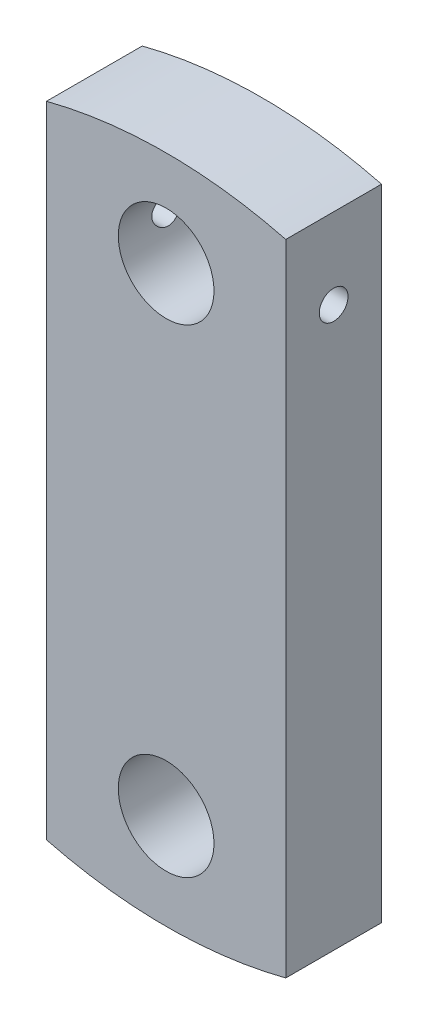
ISO-10303-21;
HEADER;
FILE_DESCRIPTION(('STEP AP214'),'2;1');
FILE_NAME('part.step','',(''),(''),'','','');
FILE_SCHEMA(('AUTOMOTIVE_DESIGN { 1 0 10303 214 1 1 1 1 }'));
ENDSEC;
DATA;
#1=APPLICATION_CONTEXT('core data for automotive mechanical design processes');
#2=APPLICATION_PROTOCOL_DEFINITION('international standard','automotive_design',2000,#1);
#3=PRODUCT_CONTEXT('',#1,'mechanical');
#4=PRODUCT('Part','Part','',(#3));
#5=PRODUCT_RELATED_PRODUCT_CATEGORY('part','',(#4));
#6=PRODUCT_DEFINITION_FORMATION('','',#4);
#7=PRODUCT_DEFINITION_CONTEXT('part definition',#1,'design');
#8=PRODUCT_DEFINITION('design','',#6,#7);
#9=PRODUCT_DEFINITION_SHAPE('','',#8);
#10=(LENGTH_UNIT() NAMED_UNIT(*) SI_UNIT(.MILLI.,.METRE.));
#11=(NAMED_UNIT(*) PLANE_ANGLE_UNIT() SI_UNIT($,.RADIAN.));
#12=(NAMED_UNIT(*) SI_UNIT($,.STERADIAN.) SOLID_ANGLE_UNIT());
#13=UNCERTAINTY_MEASURE_WITH_UNIT(LENGTH_MEASURE(1.E-05),#10,'distance_accuracy_value','');
#14=(GEOMETRIC_REPRESENTATION_CONTEXT(3) GLOBAL_UNCERTAINTY_ASSIGNED_CONTEXT((#13)) GLOBAL_UNIT_ASSIGNED_CONTEXT((#10,
#11,#12)) REPRESENTATION_CONTEXT('',''));
#15=CARTESIAN_POINT('',(0.,0.,0.));
#16=DIRECTION('',(0.,0.,1.));
#17=DIRECTION('',(1.,0.,0.));
#18=AXIS2_PLACEMENT_3D('',#15,#16,#17);
#19=CARTESIAN_POINT('',(0.,15.,10.));
#20=DIRECTION('',(0.,0.,-1.));
#21=DIRECTION('',(-1.,0.,0.));
#22=AXIS2_PLACEMENT_3D('',#19,#20,#21);
#23=PLANE('',#22);
#24=CARTESIAN_POINT('',(0.,15.,10.));
#25=DIRECTION('',(0.,0.,1.));
#26=DIRECTION('',(-1.,0.,0.));
#27=AXIS2_PLACEMENT_3D('',#24,#25,#26);
#28=CIRCLE('',#27,50.);
#29=CARTESIAN_POINT('',(-12.5,-33.4122918275927,10.));
#30=VERTEX_POINT('',#29);
#31=CARTESIAN_POINT('',(12.5,-33.4122918275927,10.));
#32=VERTEX_POINT('',#31);
#33=EDGE_CURVE('E99',#30,#32,#28,.T.);
#34=ORIENTED_EDGE('',*,*,#33,.T.);
#35=DIRECTION('',(0.,1.,0.));
#36=VECTOR('',#35,1.);
#37=CARTESIAN_POINT('',(12.5,-33.4122918275927,10.));
#38=LINE('',#37,#36);
#39=CARTESIAN_POINT('',(12.5,33.4122918275927,10.));
#40=VERTEX_POINT('',#39);
#41=EDGE_CURVE('E94',#32,#40,#38,.T.);
#42=ORIENTED_EDGE('',*,*,#41,.T.);
#43=CARTESIAN_POINT('',(0.,-15.,10.));
#44=DIRECTION('',(0.,0.,1.));
#45=DIRECTION('',(1.,0.,0.));
#46=AXIS2_PLACEMENT_3D('',#43,#44,#45);
#47=CIRCLE('',#46,50.);
#48=CARTESIAN_POINT('',(-12.5,33.4122918275927,10.));
#49=VERTEX_POINT('',#48);
#50=EDGE_CURVE('E97',#40,#49,#47,.T.);
#51=ORIENTED_EDGE('',*,*,#50,.T.);
#52=DIRECTION('',(0.,-1.,0.));
#53=VECTOR('',#52,1.);
#54=CARTESIAN_POINT('',(-12.5,-33.4122918275927,10.));
#55=LINE('',#54,#53);
#56=EDGE_CURVE('E64',#49,#30,#55,.T.);
#57=ORIENTED_EDGE('',*,*,#56,.T.);
#58=EDGE_LOOP('',(#34,#42,#51,#57));
#59=FACE_BOUND('',#58,.T.);
#60=CARTESIAN_POINT('',(0.,-25.,10.));
#61=DIRECTION('',(0.,0.,1.));
#62=DIRECTION('',(1.,0.,0.));
#63=AXIS2_PLACEMENT_3D('',#60,#61,#62);
#64=CIRCLE('',#63,5.);
#65=CARTESIAN_POINT('',(5.00000000000001,-25.,10.));
#66=VERTEX_POINT('',#65);
#67=EDGE_CURVE('E120',#66,#66,#64,.T.);
#68=ORIENTED_EDGE('',*,*,#67,.F.);
#69=EDGE_LOOP('',(#68));
#70=FACE_BOUND('',#69,.T.);
#71=CARTESIAN_POINT('',(0.,25.,10.));
#72=DIRECTION('',(0.,0.,1.));
#73=DIRECTION('',(1.,0.,0.));
#74=AXIS2_PLACEMENT_3D('',#71,#72,#73);
#75=CIRCLE('',#74,5.);
#76=CARTESIAN_POINT('',(5.,25.,10.));
#77=VERTEX_POINT('',#76);
#78=EDGE_CURVE('E183',#77,#77,#75,.T.);
#79=ORIENTED_EDGE('',*,*,#78,.F.);
#80=EDGE_LOOP('',(#79));
#81=FACE_BOUND('',#80,.T.);
#82=ADVANCED_FACE('F39',(#59,#70,#81),#23,.F.);
#83=CARTESIAN_POINT('',(0.,15.,0.));
#84=DIRECTION('',(0.,0.,-1.));
#85=DIRECTION('',(-1.,0.,0.));
#86=AXIS2_PLACEMENT_3D('',#83,#84,#85);
#87=PLANE('',#86);
#88=CARTESIAN_POINT('',(0.,-25.,0.));
#89=DIRECTION('',(0.,0.,1.));
#90=DIRECTION('',(1.,0.,0.));
#91=AXIS2_PLACEMENT_3D('',#88,#89,#90);
#92=CIRCLE('',#91,5.);
#93=CARTESIAN_POINT('',(5.00000000000001,-25.,0.));
#94=VERTEX_POINT('',#93);
#95=EDGE_CURVE('E187',#94,#94,#92,.T.);
#96=ORIENTED_EDGE('',*,*,#95,.T.);
#97=EDGE_LOOP('',(#96));
#98=FACE_BOUND('',#97,.T.);
#99=CARTESIAN_POINT('',(0.,15.,0.));
#100=DIRECTION('',(0.,0.,1.));
#101=DIRECTION('',(-1.,0.,0.));
#102=AXIS2_PLACEMENT_3D('',#99,#100,#101);
#103=CIRCLE('',#102,50.);
#104=CARTESIAN_POINT('',(-12.5,-33.4122918275927,0.));
#105=VERTEX_POINT('',#104);
#106=CARTESIAN_POINT('',(12.5,-33.4122918275927,0.));
#107=VERTEX_POINT('',#106);
#108=EDGE_CURVE('E116',#105,#107,#103,.T.);
#109=ORIENTED_EDGE('',*,*,#108,.F.);
#110=DIRECTION('',(0.,-1.,0.));
#111=VECTOR('',#110,1.);
#112=CARTESIAN_POINT('',(-12.5,-33.4122918275927,0.));
#113=LINE('',#112,#111);
#114=CARTESIAN_POINT('',(-12.5,33.4122918275927,0.));
#115=VERTEX_POINT('',#114);
#116=EDGE_CURVE('E87',#115,#105,#113,.T.);
#117=ORIENTED_EDGE('',*,*,#116,.F.);
#118=CARTESIAN_POINT('',(0.,-15.,0.));
#119=DIRECTION('',(0.,0.,1.));
#120=DIRECTION('',(1.,0.,0.));
#121=AXIS2_PLACEMENT_3D('',#118,#119,#120);
#122=CIRCLE('',#121,50.);
#123=CARTESIAN_POINT('',(12.5,33.4122918275927,0.));
#124=VERTEX_POINT('',#123);
#125=EDGE_CURVE('E81',#124,#115,#122,.T.);
#126=ORIENTED_EDGE('',*,*,#125,.F.);
#127=DIRECTION('',(0.,1.,0.));
#128=VECTOR('',#127,1.);
#129=CARTESIAN_POINT('',(12.5,-33.4122918275927,0.));
#130=LINE('',#129,#128);
#131=EDGE_CURVE('E104',#107,#124,#130,.T.);
#132=ORIENTED_EDGE('',*,*,#131,.F.);
#133=EDGE_LOOP('',(#109,#117,#126,#132));
#134=FACE_BOUND('',#133,.T.);
#135=CARTESIAN_POINT('',(0.,25.,0.));
#136=DIRECTION('',(0.,0.,1.));
#137=DIRECTION('',(1.,0.,0.));
#138=AXIS2_PLACEMENT_3D('',#135,#136,#137);
#139=CIRCLE('',#138,5.);
#140=CARTESIAN_POINT('',(5.,25.,0.));
#141=VERTEX_POINT('',#140);
#142=EDGE_CURVE('E188',#141,#141,#139,.T.);
#143=ORIENTED_EDGE('',*,*,#142,.T.);
#144=EDGE_LOOP('',(#143));
#145=FACE_BOUND('',#144,.T.);
#146=ADVANCED_FACE('F155',(#98,#134,#145),#87,.T.);
#147=CARTESIAN_POINT('',(0.,15.,10.));
#148=DIRECTION('',(0.,0.,-1.));
#149=DIRECTION('',(-1.,0.,0.));
#150=AXIS2_PLACEMENT_3D('',#147,#148,#149);
#151=CYLINDRICAL_SURFACE('',#150,50.);
#152=ORIENTED_EDGE('',*,*,#108,.T.);
#153=DIRECTION('',(0.,0.,-1.));
#154=VECTOR('',#153,1.);
#155=CARTESIAN_POINT('',(12.5,-33.4122918275927,10.));
#156=LINE('',#155,#154);
#157=EDGE_CURVE('E11',#32,#107,#156,.T.);
#158=ORIENTED_EDGE('',*,*,#157,.F.);
#159=ORIENTED_EDGE('',*,*,#33,.F.);
#160=DIRECTION('',(0.,0.,-1.));
#161=VECTOR('',#160,1.);
#162=CARTESIAN_POINT('',(-12.5,-33.4122918275927,10.));
#163=LINE('',#162,#161);
#164=EDGE_CURVE('E112',#30,#105,#163,.T.);
#165=ORIENTED_EDGE('',*,*,#164,.T.);
#166=EDGE_LOOP('',(#152,#158,#159,#165));
#167=FACE_BOUND('',#166,.T.);
#168=ADVANCED_FACE('F41',(#167),#151,.T.);
#169=CARTESIAN_POINT('',(12.5,-33.4122918275927,10.));
#170=DIRECTION('',(-1.,0.,0.));
#171=DIRECTION('',(0.,-1.,0.));
#172=AXIS2_PLACEMENT_3D('',#169,#170,#171);
#173=PLANE('',#172);
#174=CARTESIAN_POINT('',(12.5,25.,5.));
#175=DIRECTION('',(1.,0.,0.));
#176=DIRECTION('',(0.,1.,0.));
#177=AXIS2_PLACEMENT_3D('',#174,#175,#176);
#178=CIRCLE('',#177,1.5);
#179=CARTESIAN_POINT('',(12.5,26.5,5.));
#180=VERTEX_POINT('',#179);
#181=EDGE_CURVE('E176',#180,#180,#178,.T.);
#182=ORIENTED_EDGE('',*,*,#181,.F.);
#183=EDGE_LOOP('',(#182));
#184=FACE_BOUND('',#183,.T.);
#185=ORIENTED_EDGE('',*,*,#131,.T.);
#186=DIRECTION('',(0.,0.,-1.));
#187=VECTOR('',#186,1.);
#188=CARTESIAN_POINT('',(12.5,33.4122918275927,10.));
#189=LINE('',#188,#187);
#190=EDGE_CURVE('E55',#40,#124,#189,.T.);
#191=ORIENTED_EDGE('',*,*,#190,.F.);
#192=ORIENTED_EDGE('',*,*,#41,.F.);
#193=ORIENTED_EDGE('',*,*,#157,.T.);
#194=EDGE_LOOP('',(#185,#191,#192,#193));
#195=FACE_BOUND('',#194,.T.);
#196=ADVANCED_FACE('F103',(#184,#195),#173,.F.);
#197=CARTESIAN_POINT('',(0.,-15.,10.));
#198=DIRECTION('',(0.,0.,-1.));
#199=DIRECTION('',(-1.,0.,0.));
#200=AXIS2_PLACEMENT_3D('',#197,#198,#199);
#201=CYLINDRICAL_SURFACE('',#200,50.);
#202=ORIENTED_EDGE('',*,*,#125,.T.);
#203=DIRECTION('',(0.,0.,-1.));
#204=VECTOR('',#203,1.);
#205=CARTESIAN_POINT('',(-12.5,33.4122918275927,10.));
#206=LINE('',#205,#204);
#207=EDGE_CURVE('E106',#49,#115,#206,.T.);
#208=ORIENTED_EDGE('',*,*,#207,.F.);
#209=ORIENTED_EDGE('',*,*,#50,.F.);
#210=ORIENTED_EDGE('',*,*,#190,.T.);
#211=EDGE_LOOP('',(#202,#208,#209,#210));
#212=FACE_BOUND('',#211,.T.);
#213=ADVANCED_FACE('F108',(#212),#201,.T.);
#214=CARTESIAN_POINT('',(-12.5,-33.4122918275927,10.));
#215=DIRECTION('',(1.,0.,0.));
#216=DIRECTION('',(0.,1.,0.));
#217=AXIS2_PLACEMENT_3D('',#214,#215,#216);
#218=PLANE('',#217);
#219=CARTESIAN_POINT('',(-12.5,25.,5.));
#220=DIRECTION('',(1.,0.,0.));
#221=DIRECTION('',(0.,1.,0.));
#222=AXIS2_PLACEMENT_3D('',#219,#220,#221);
#223=CIRCLE('',#222,1.5);
#224=CARTESIAN_POINT('',(-12.5,26.5,5.));
#225=VERTEX_POINT('',#224);
#226=EDGE_CURVE('E136',#225,#225,#223,.T.);
#227=ORIENTED_EDGE('',*,*,#226,.T.);
#228=EDGE_LOOP('',(#227));
#229=FACE_BOUND('',#228,.T.);
#230=ORIENTED_EDGE('',*,*,#116,.T.);
#231=ORIENTED_EDGE('',*,*,#164,.F.);
#232=ORIENTED_EDGE('',*,*,#56,.F.);
#233=ORIENTED_EDGE('',*,*,#207,.T.);
#234=EDGE_LOOP('',(#230,#231,#232,#233));
#235=FACE_BOUND('',#234,.T.);
#236=ADVANCED_FACE('F163',(#229,#235),#218,.F.);
#237=CARTESIAN_POINT('',(0.,-25.,10.));
#238=DIRECTION('',(0.,0.,-1.));
#239=DIRECTION('',(-1.,0.,0.));
#240=AXIS2_PLACEMENT_3D('',#237,#238,#239);
#241=CYLINDRICAL_SURFACE('',#240,5.);
#242=ORIENTED_EDGE('',*,*,#67,.T.);
#243=EDGE_LOOP('',(#242));
#244=FACE_BOUND('',#243,.T.);
#245=ORIENTED_EDGE('',*,*,#95,.F.);
#246=EDGE_LOOP('',(#245));
#247=FACE_BOUND('',#246,.T.);
#248=ADVANCED_FACE('F151',(#244,#247),#241,.F.);
#249=CARTESIAN_POINT('',(0.,25.,10.));
#250=DIRECTION('',(0.,0.,-1.));
#251=DIRECTION('',(-1.,0.,0.));
#252=AXIS2_PLACEMENT_3D('',#249,#250,#251);
#253=CYLINDRICAL_SURFACE('',#252,5.);
#254=CARTESIAN_POINT('',(-5.,25.,6.5));
#255=CARTESIAN_POINT('',(-4.9999992925055,24.9177113872467,6.49999900251511));
#256=CARTESIAN_POINT('',(-4.99794915693954,24.8354126816485,6.49320613637603));
#257=CARTESIAN_POINT('',(-4.98997105593691,24.6732118746951,6.4662786457779));
#258=CARTESIAN_POINT('',(-4.98404193389692,24.5933104955886,6.44614004197666));
#259=CARTESIAN_POINT('',(-4.96895552501836,24.4382672922455,6.39325398308974));
#260=CARTESIAN_POINT('',(-4.95980300250426,24.3631186356046,6.36052513038106));
#261=CARTESIAN_POINT('',(-4.93922109237645,24.2193758189469,6.28346390694416));
#262=CARTESIAN_POINT('',(-4.92779140192067,24.1507825325303,6.23912999260458));
#263=CARTESIAN_POINT('',(-4.90350737192774,24.0201282028163,6.13877599252733));
#264=CARTESIAN_POINT('',(-4.89062383657036,23.9582819287557,6.08248337411409));
#265=CARTESIAN_POINT('',(-4.86505834210442,23.8447507907668,5.96039077008981));
#266=CARTESIAN_POINT('',(-4.85237641724502,23.7930676367256,5.89458918787504));
#267=CARTESIAN_POINT('',(-4.82834113993772,23.7001996227629,5.75352924696239));
#268=CARTESIAN_POINT('',(-4.81702406663875,23.6592769097779,5.67809153900926));
#269=CARTESIAN_POINT('',(-4.79743620394031,23.5907860522524,5.52101074576971));
#270=CARTESIAN_POINT('',(-4.78916468313311,23.5632147008003,5.43936915607202));
#271=CARTESIAN_POINT('',(-4.77690870838434,23.5229836631735,5.27460973386954));
#272=CARTESIAN_POINT('',(-4.77281069324534,23.5099280376532,5.19159725613605));
#273=CARTESIAN_POINT('',(-4.76902789749767,23.4978626938533,5.02446684378323));
#274=CARTESIAN_POINT('',(-4.76934204760571,23.4988495723892,4.94034918194091));
#275=CARTESIAN_POINT('',(-4.77424744067778,23.5145302280019,4.77661609139151));
#276=CARTESIAN_POINT('',(-4.77868388599141,23.5287279473732,4.69694774963776));
#277=CARTESIAN_POINT('',(-4.79108356228624,23.5696257957294,4.54118021372654));
#278=CARTESIAN_POINT('',(-4.79904714132351,23.5963271585836,4.46508137262566));
#279=CARTESIAN_POINT('',(-4.81772733074973,23.6618397334632,4.31739965033926));
#280=CARTESIAN_POINT('',(-4.82848016115952,23.7008118306536,4.24589291604473));
#281=CARTESIAN_POINT('',(-4.85150987000065,23.7896477741132,4.1102679779898));
#282=CARTESIAN_POINT('',(-4.86378711746991,23.8395142599741,4.04615157058622));
#283=CARTESIAN_POINT('',(-4.88911011297938,23.9511870923445,3.92431380923798));
#284=CARTESIAN_POINT('',(-4.90216654310498,24.013405092533,3.86697133597033));
#285=CARTESIAN_POINT('',(-4.92712244063259,24.146736740686,3.76344601593575));
#286=CARTESIAN_POINT('',(-4.9390218351841,24.2178509481391,3.71726387158557));
#287=CARTESIAN_POINT('',(-4.96043160069471,24.3676449616572,3.63714007753527));
#288=CARTESIAN_POINT('',(-4.96992543668314,24.4463722502521,3.60328248375014));
#289=CARTESIAN_POINT('',(-4.98533521832222,24.6087545843965,3.54940040990037));
#290=CARTESIAN_POINT('',(-4.99125216187,24.6924082484104,3.52937207146751));
#291=CARTESIAN_POINT('',(-4.99868364643539,24.8590477573317,3.5043478221006));
#292=CARTESIAN_POINT('',(-5.0003485041779,24.9419499023988,3.49883841419839));
#293=CARTESIAN_POINT('',(-4.9995292324176,25.1074996058234,3.50156915571208));
#294=CARTESIAN_POINT('',(-4.99704565677757,25.1901471966908,3.50980746965144));
#295=CARTESIAN_POINT('',(-4.98830696987163,25.3509036053097,3.5393846111115));
#296=CARTESIAN_POINT('',(-4.98213829799417,25.4290727726142,3.56042338758087));
#297=CARTESIAN_POINT('',(-4.96674347841533,25.5807546389545,3.6146432327782));
#298=CARTESIAN_POINT('',(-4.95751696321085,25.6542667770256,3.64782576103786));
#299=CARTESIAN_POINT('',(-4.93669654351325,25.7964371894611,3.72625316548113));
#300=CARTESIAN_POINT('',(-4.92505280829675,25.8649438261997,3.77175934094797));
#301=CARTESIAN_POINT('',(-4.90073468764318,25.9935233079802,3.87322475405281));
#302=CARTESIAN_POINT('',(-4.8880600443108,26.0535940323559,3.92918661188767));
#303=CARTESIAN_POINT('',(-4.86253171869138,26.1658574455103,4.05238730836935));
#304=CARTESIAN_POINT('',(-4.84968825033268,26.217684812315,4.11996187577174));
#305=CARTESIAN_POINT('',(-4.82576515238464,26.3092899507215,4.26312793901353));
#306=CARTESIAN_POINT('',(-4.81468547654651,26.3490680382947,4.33871922455822));
#307=CARTESIAN_POINT('',(-4.79567189615055,26.4151734712717,4.49553249125469));
#308=CARTESIAN_POINT('',(-4.78772337843827,26.4415634693705,4.57672618653659));
#309=CARTESIAN_POINT('',(-4.77591594362794,26.4802173081511,4.74268796893148));
#310=CARTESIAN_POINT('',(-4.772055625083,26.4924859897878,4.82745482078767));
#311=CARTESIAN_POINT('',(-4.76899972496087,26.5022198448506,4.99436151837623));
#312=CARTESIAN_POINT('',(-4.76961647442755,26.5002805530849,5.07646365101759));
#313=CARTESIAN_POINT('',(-4.77499401288294,26.4830750544481,5.2391141033728));
#314=CARTESIAN_POINT('',(-4.77975463592551,26.4678093812472,5.31966248517636));
#315=CARTESIAN_POINT('',(-4.79275763670386,26.4247688880414,5.47594539914285));
#316=CARTESIAN_POINT('',(-4.80095604545965,26.3971517550707,5.5517272873617));
#317=CARTESIAN_POINT('',(-4.81990278909136,26.3303150712113,5.69764243881773));
#318=CARTESIAN_POINT('',(-4.83065161194312,26.2910932996288,5.76777461764076));
#319=CARTESIAN_POINT('',(-4.85397676425833,26.2004876380507,5.90316311652711));
#320=CARTESIAN_POINT('',(-4.86660540163798,26.1487127609299,5.96814876126041));
#321=CARTESIAN_POINT('',(-4.89201320450026,26.0351743462978,6.08870249830786));
#322=CARTESIAN_POINT('',(-4.90479240823905,25.9734082171345,6.14426813946776));
#323=CARTESIAN_POINT('',(-4.92950936570649,25.8394657621833,6.24602341229503));
#324=CARTESIAN_POINT('',(-4.94141159765674,25.7670378857906,6.29189144685549));
#325=CARTESIAN_POINT('',(-4.96260680455813,25.6151413739835,6.37073516990402));
#326=CARTESIAN_POINT('',(-4.97190099931067,25.535676052999,6.40371688827451));
#327=CARTESIAN_POINT('',(-4.98602174969301,25.3807577126553,6.45289527565275));
#328=CARTESIAN_POINT('',(-4.99122027381068,25.3057869619542,6.47051167288325));
#329=CARTESIAN_POINT('',(-4.99820944494492,25.1538801952308,6.49406352524158));
#330=CARTESIAN_POINT('',(-5.0000006615474,25.0769445098581,6.50000093270482));
#331=CARTESIAN_POINT('',(-5.,25.,6.5));
#332=B_SPLINE_CURVE_WITH_KNOTS('',3,(#254,#255,#256,#257,#258,#259,#260,#261,#262,#263,#264,
#265,#266,#267,#268,#269,#270,#271,#272,#273,#274,#275,#276,#277,#278,#279,#280,#281,#282,#283,
#284,#285,#286,#287,#288,#289,#290,#291,#292,#293,#294,#295,#296,#297,#298,#299,#300,#301,#302,
#303,#304,#305,#306,#307,#308,#309,#310,#311,#312,#313,#314,#315,#316,#317,#318,#319,#320,#321,
#322,#323,#324,#325,#326,#327,#328,#329,#330,#331),.UNSPECIFIED.,.T.,.F.,(4,2,2,2,2,2,2,2,2,2,2,
2,2,2,2,2,2,2,2,2,2,2,2,2,2,2,2,2,2,2,2,2,2,2,2,2,2,2,4),(0.,0.246583203612611,
0.493239964846001,0.739533676300876,0.985860164412701,1.23855602948192,1.49129437288633,
1.74971481004109,2.00807314543224,2.25919689356599,2.5102597831909,2.75226016697676,
2.99428443658002,3.2396242644712,3.48502360158556,3.74067104048167,3.99633456531072,
4.25371046881689,4.51101453528808,4.75908809438545,5.00712853550327,5.24956746682327,
5.49203554593729,5.74011305702909,5.98825282000192,6.24540400322819,6.50254844252681,
6.75847814951252,7.01432009460283,7.25950155466943,7.504673196616,7.74680040402722,
7.98897397553108,8.23996925679931,8.49102974897503,8.74942996156671,9.00770911595235,
9.2383169193046,9.46888616948875),.UNSPECIFIED.);
#333=CARTESIAN_POINT('',(-5.,25.,6.5));
#334=VERTEX_POINT('',#333);
#335=EDGE_CURVE('E43',#334,#334,#332,.T.);
#336=ORIENTED_EDGE('',*,*,#335,.F.);
#337=EDGE_LOOP('',(#336));
#338=FACE_BOUND('',#337,.T.);
#339=CARTESIAN_POINT('',(4.76969600708473,26.5,5.));
#340=CARTESIAN_POINT('',(4.7696968572698,26.4999989763376,4.9178054520576));
#341=CARTESIAN_POINT('',(4.77184390209069,26.4932210816714,4.83560077585597));
#342=CARTESIAN_POINT('',(4.780165783029,26.4663584444675,4.67359475040806));
#343=CARTESIAN_POINT('',(4.78634196493468,26.4462692557358,4.59379421349853));
#344=CARTESIAN_POINT('',(4.80196102485633,26.3935275326996,4.43896527172827));
#345=CARTESIAN_POINT('',(4.81139846703232,26.3608958939424,4.36392917036691));
#346=CARTESIAN_POINT('',(4.83246932547567,26.2840642191793,4.2203780660047));
#347=CARTESIAN_POINT('',(4.8441030704102,26.2398624513705,4.15186404131556));
#348=CARTESIAN_POINT('',(4.86866862185766,26.1396475414163,4.02113360942263));
#349=CARTESIAN_POINT('',(4.88162808311636,26.0833320717581,3.95915410205371));
#350=CARTESIAN_POINT('',(4.90714861936757,25.9611362375796,3.84536204867749));
#351=CARTESIAN_POINT('',(4.91970964297705,25.8952546454611,3.79355080955012));
#352=CARTESIAN_POINT('',(4.94333214579389,25.7541114377937,3.70053730016669));
#353=CARTESIAN_POINT('',(4.95435724342405,25.6786840213358,3.65957657555719));
#354=CARTESIAN_POINT('',(4.97334435920685,25.5216246453694,3.59101274095724));
#355=CARTESIAN_POINT('',(4.98130703789496,25.4399940283879,3.56340675014255));
#356=CARTESIAN_POINT('',(4.9930764600359,25.2753238526308,3.52311999890949));
#357=CARTESIAN_POINT('',(4.99699557369339,25.1923913989538,3.5100348723473));
#358=CARTESIAN_POINT('',(5.00063201501348,25.0254218237493,3.49788267535356));
#359=CARTESIAN_POINT('',(5.00035022521079,24.9413849379496,3.49881266059804));
#360=CARTESIAN_POINT('',(4.99569603817659,24.7774288433998,3.51439286854302));
#361=CARTESIAN_POINT('',(4.99145420205261,24.6974637323587,3.52860519380987));
#362=CARTESIAN_POINT('',(4.97951522112593,24.5411107865575,3.56963133599429));
#363=CARTESIAN_POINT('',(4.97181785750586,24.4647231786772,3.59644595094267));
#364=CARTESIAN_POINT('',(4.95365220986963,24.3166526736487,3.66221202341856));
#365=CARTESIAN_POINT('',(4.94315269676706,24.2450349353055,3.70130120280727));
#366=CARTESIAN_POINT('',(4.9204964064807,24.1092353262169,3.79039785242823));
#367=CARTESIAN_POINT('',(4.90833923637778,24.0450552251279,3.84040791296348));
#368=CARTESIAN_POINT('',(4.88311550488166,23.9233395184702,3.95219775075159));
#369=CARTESIAN_POINT('',(4.87003195321461,23.8661554195989,4.01435691902973));
#370=CARTESIAN_POINT('',(4.84483979887497,23.7629234846018,4.14751001789005));
#371=CARTESIAN_POINT('',(4.8327312931702,23.7168767551715,4.21850482538923));
#372=CARTESIAN_POINT('',(4.81077903197678,23.6368600466455,4.36823946924899));
#373=CARTESIAN_POINT('',(4.80095810695957,23.6030101076232,4.44704704586292));
#374=CARTESIAN_POINT('',(4.78496392548436,23.5491663712159,4.60960720844554));
#375=CARTESIAN_POINT('',(4.7787894791583,23.5291680535944,4.69335817153456));
#376=CARTESIAN_POINT('',(4.77104849541242,23.5042522971784,4.86008236073928));
#377=CARTESIAN_POINT('',(4.76931878670441,23.4988005361979,4.94296822389398));
#378=CARTESIAN_POINT('',(4.77021192441924,23.5016405276694,5.10847290000987));
#379=CARTESIAN_POINT('',(4.7728341615659,23.5099303562867,5.19109174873085));
#380=CARTESIAN_POINT('',(4.78197558554912,23.5395423642581,5.35148837797087));
#381=CARTESIAN_POINT('',(4.78839176507489,23.5605203856872,5.42933616426352));
#382=CARTESIAN_POINT('',(4.80429141231228,23.6145142225206,5.58040169081492));
#383=CARTESIAN_POINT('',(4.81377535359074,23.6475318965724,5.65361871414057));
#384=CARTESIAN_POINT('',(4.83505835023048,23.725681288035,5.79551746407213));
#385=CARTESIAN_POINT('',(4.84691271069799,23.7711143582727,5.86402472098579));
#386=CARTESIAN_POINT('',(4.87148205646987,23.8724469839962,5.9926381061808));
#387=CARTESIAN_POINT('',(4.88419724730004,23.928349044651,6.05274221761279));
#388=CARTESIAN_POINT('',(4.90963633548159,24.0515448675064,6.16518040581474));
#389=CARTESIAN_POINT('',(4.92234245063004,24.1191889341426,6.21713562898698));
#390=CARTESIAN_POINT('',(4.94584851748651,24.2625382154098,6.30896670102775));
#391=CARTESIAN_POINT('',(4.95664856384717,24.3382430294561,6.34884314978146));
#392=CARTESIAN_POINT('',(4.97505970474958,24.4950644952948,6.4150000305683));
#393=CARTESIAN_POINT('',(4.98269453424966,24.5761353779622,6.44138201615898));
#394=CARTESIAN_POINT('',(4.99401979596827,24.7418300334954,6.48006091889042));
#395=CARTESIAN_POINT('',(4.9977113567088,24.8264527826452,6.49236186594842));
#396=CARTESIAN_POINT('',(5.000665440814,24.9933478461173,6.5022230440545));
#397=CARTESIAN_POINT('',(5.00009305111322,25.0755851790862,6.50033269540783));
#398=CARTESIAN_POINT('',(4.99497264465037,25.2385194811644,6.48317836750088));
#399=CARTESIAN_POINT('',(4.99042485330463,25.3192165373465,6.46791514651956));
#400=CARTESIAN_POINT('',(4.97791168358327,25.4759358130414,6.42478833860037));
#401=CARTESIAN_POINT('',(4.96998352900866,25.5519989273514,6.39706181935099));
#402=CARTESIAN_POINT('',(4.9515294303945,25.6984332377521,6.32991808549281));
#403=CARTESIAN_POINT('',(4.94100305949946,25.7688034960506,6.29049894971381));
#404=CARTESIAN_POINT('',(4.91803965828228,25.9043018924206,6.19962654256996));
#405=CARTESIAN_POINT('',(4.90555226923559,25.9691902500768,6.14782856999923));
#406=CARTESIAN_POINT('',(4.88023537212334,26.089537571346,6.0342896116672));
#407=CARTESIAN_POINT('',(4.86740576641079,26.1449938096019,5.97254576210185));
#408=CARTESIAN_POINT('',(4.84240680631319,26.2465626939455,5.83865922168949));
#409=CARTESIAN_POINT('',(4.83026852693486,26.2923475975796,5.76626144660956));
#410=CARTESIAN_POINT('',(4.80852547508793,26.3710431352878,5.61444482583898));
#411=CARTESIAN_POINT('',(4.79891948596956,26.4039599555729,5.5350293763988));
#412=CARTESIAN_POINT('',(4.78427816717595,26.4530194253295,5.38025956839373));
#413=CARTESIAN_POINT('',(4.7788615484052,26.4705885901123,5.30539135306901));
#414=CARTESIAN_POINT('',(4.77157042597167,26.4940781883514,5.15368477750423));
#415=CARTESIAN_POINT('',(4.76969521221431,26.500000957061,5.07684681535475));
#416=CARTESIAN_POINT('',(4.76969600708473,26.5,5.));
#417=B_SPLINE_CURVE_WITH_KNOTS('',3,(#339,#340,#341,#342,#343,#344,#345,#346,#347,#348,#349,
#350,#351,#352,#353,#354,#355,#356,#357,#358,#359,#360,#361,#362,#363,#364,#365,#366,#367,#368,
#369,#370,#371,#372,#373,#374,#375,#376,#377,#378,#379,#380,#381,#382,#383,#384,#385,#386,#387,
#388,#389,#390,#391,#392,#393,#394,#395,#396,#397,#398,#399,#400,#401,#402,#403,#404,#405,#406,
#407,#408,#409,#410,#411,#412,#413,#414,#415,#416),.UNSPECIFIED.,.T.,.F.,(4,2,2,2,2,2,2,2,2,2,2,
2,2,2,2,2,2,2,2,2,2,2,2,2,2,2,2,2,2,2,2,2,2,2,2,2,2,2,4),(0.,0.246300165915543,
0.492682641688999,0.738656414466193,0.9846670253701,1.23773150007983,1.49082847871273,
1.74915939273645,2.00743455587877,2.25832140149558,2.5091555410144,2.7520012599088,
2.99486235890376,3.24055209335676,3.4863001659083,3.74152147023278,3.99676812491863,
4.25446238246266,4.51207250628411,4.76008080790309,5.00805439107388,5.24958594938817,
5.49115481045787,5.73920731809389,5.98731925928923,6.24479506100602,6.50225807324202,
6.75775391814325,7.01317662321682,7.2587630391122,7.50433553047755,7.74727096872219,
7.99024634491379,8.24099627054489,8.4918185262989,8.75011639669147,9.00828993963945,
9.23861153857448,9.46888695033561),.UNSPECIFIED.);
#418=CARTESIAN_POINT('',(4.76969600708473,26.5,5.));
#419=VERTEX_POINT('',#418);
#420=EDGE_CURVE('E130',#419,#419,#417,.T.);
#421=ORIENTED_EDGE('',*,*,#420,.F.);
#422=EDGE_LOOP('',(#421));
#423=FACE_BOUND('',#422,.T.);
#424=ORIENTED_EDGE('',*,*,#78,.T.);
#425=EDGE_LOOP('',(#424));
#426=FACE_BOUND('',#425,.T.);
#427=ORIENTED_EDGE('',*,*,#142,.F.);
#428=EDGE_LOOP('',(#427));
#429=FACE_BOUND('',#428,.T.);
#430=ADVANCED_FACE('F137',(#338,#423,#426,#429),#253,.F.);
#431=CARTESIAN_POINT('',(-12.5,25.,5.));
#432=DIRECTION('',(1.,0.,0.));
#433=DIRECTION('',(0.,1.,0.));
#434=AXIS2_PLACEMENT_3D('',#431,#432,#433);
#435=CYLINDRICAL_SURFACE('',#434,1.5);
#436=ORIENTED_EDGE('',*,*,#420,.T.);
#437=EDGE_LOOP('',(#436));
#438=FACE_BOUND('',#437,.T.);
#439=ORIENTED_EDGE('',*,*,#181,.T.);
#440=EDGE_LOOP('',(#439));
#441=FACE_BOUND('',#440,.T.);
#442=ADVANCED_FACE('F140',(#438,#441),#435,.F.);
#443=ORIENTED_EDGE('',*,*,#335,.T.);
#444=EDGE_LOOP('',(#443));
#445=FACE_BOUND('',#444,.T.);
#446=ORIENTED_EDGE('',*,*,#226,.F.);
#447=EDGE_LOOP('',(#446));
#448=FACE_BOUND('',#447,.T.);
#449=ADVANCED_FACE('F143',(#445,#448),#435,.F.);
#450=CLOSED_SHELL('',(#82,#146,#168,#196,#213,#236,#248,#430,#442,#449));
#451=MANIFOLD_SOLID_BREP('B2',#450);
#452=ADVANCED_BREP_SHAPE_REPRESENTATION('',(#18,#451),#14);
#453=SHAPE_DEFINITION_REPRESENTATION(#9,#452);
ENDSEC;
END-ISO-10303-21;
